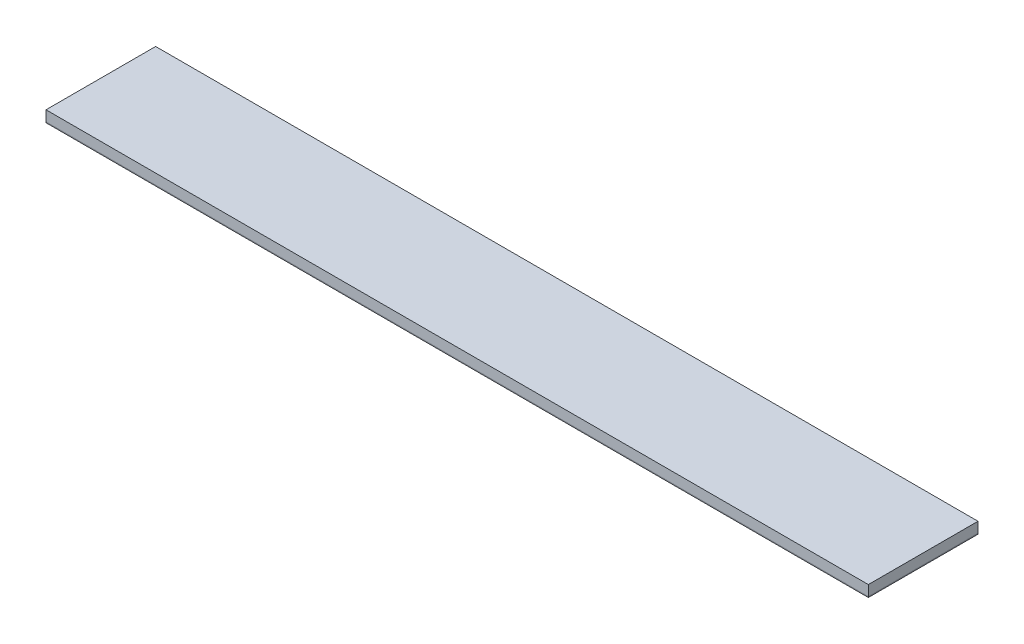
ISO-10303-21;
HEADER;
FILE_DESCRIPTION(('STEP AP214'),'2;1');
FILE_NAME('part.step','',(''),(''),'','','');
FILE_SCHEMA(('AUTOMOTIVE_DESIGN { 1 0 10303 214 1 1 1 1 }'));
ENDSEC;
DATA;
#1=APPLICATION_CONTEXT('core data for automotive mechanical design processes');
#2=APPLICATION_PROTOCOL_DEFINITION('international standard','automotive_design',2000,#1);
#3=PRODUCT_CONTEXT('',#1,'mechanical');
#4=PRODUCT('Part','Part','',(#3));
#5=PRODUCT_RELATED_PRODUCT_CATEGORY('part','',(#4));
#6=PRODUCT_DEFINITION_FORMATION('','',#4);
#7=PRODUCT_DEFINITION_CONTEXT('part definition',#1,'design');
#8=PRODUCT_DEFINITION('design','',#6,#7);
#9=PRODUCT_DEFINITION_SHAPE('','',#8);
#10=(LENGTH_UNIT() NAMED_UNIT(*) SI_UNIT(.MILLI.,.METRE.));
#11=(NAMED_UNIT(*) PLANE_ANGLE_UNIT() SI_UNIT($,.RADIAN.));
#12=(NAMED_UNIT(*) SI_UNIT($,.STERADIAN.) SOLID_ANGLE_UNIT());
#13=UNCERTAINTY_MEASURE_WITH_UNIT(LENGTH_MEASURE(1.E-05),#10,'distance_accuracy_value','');
#14=(GEOMETRIC_REPRESENTATION_CONTEXT(3) GLOBAL_UNCERTAINTY_ASSIGNED_CONTEXT((#13)) GLOBAL_UNIT_ASSIGNED_CONTEXT((#10,
#11,#12)) REPRESENTATION_CONTEXT('',''));
#15=CARTESIAN_POINT('',(0.,0.,0.));
#16=DIRECTION('',(0.,0.,1.));
#17=DIRECTION('',(1.,0.,0.));
#18=AXIS2_PLACEMENT_3D('',#15,#16,#17);
#19=CARTESIAN_POINT('',(-750.,0.,100.));
#20=DIRECTION('',(0.,1.,0.));
#21=DIRECTION('',(1.,0.,0.));
#22=AXIS2_PLACEMENT_3D('',#19,#20,#21);
#23=PLANE('',#22);
#24=DIRECTION('',(-1.,0.,0.));
#25=VECTOR('',#24,1.);
#26=CARTESIAN_POINT('',(0.,0.,0.));
#27=LINE('',#26,#25);
#28=CARTESIAN_POINT('',(0.,0.,0.));
#29=VERTEX_POINT('',#28);
#30=CARTESIAN_POINT('',(-1500.,0.,0.));
#31=VERTEX_POINT('',#30);
#32=EDGE_CURVE('P0_E28',#29,#31,#27,.T.);
#33=ORIENTED_EDGE('',*,*,#32,.F.);
#34=DIRECTION('',(0.,0.,-1.));
#35=VECTOR('',#34,1.);
#36=CARTESIAN_POINT('',(0.,0.,200.));
#37=LINE('',#36,#35);
#38=CARTESIAN_POINT('',(0.,0.,200.));
#39=VERTEX_POINT('',#38);
#40=EDGE_CURVE('P0_E89',#39,#29,#37,.T.);
#41=ORIENTED_EDGE('',*,*,#40,.F.);
#42=DIRECTION('',(1.,0.,0.));
#43=VECTOR('',#42,1.);
#44=CARTESIAN_POINT('',(-1500.,0.,200.));
#45=LINE('',#44,#43);
#46=CARTESIAN_POINT('',(-1500.,0.,200.));
#47=VERTEX_POINT('',#46);
#48=EDGE_CURVE('P0_E100',#47,#39,#45,.T.);
#49=ORIENTED_EDGE('',*,*,#48,.F.);
#50=DIRECTION('',(0.,0.,1.));
#51=VECTOR('',#50,1.);
#52=CARTESIAN_POINT('',(-1500.,0.,0.));
#53=LINE('',#52,#51);
#54=EDGE_CURVE('P0_E103',#31,#47,#53,.T.);
#55=ORIENTED_EDGE('',*,*,#54,.F.);
#56=EDGE_LOOP('',(#33,#41,#49,#55));
#57=FACE_BOUND('',#56,.T.);
#58=ADVANCED_FACE('P0_F17',(#57),#23,.F.);
#59=CARTESIAN_POINT('',(-750.,19.,100.));
#60=DIRECTION('',(0.,1.,0.));
#61=DIRECTION('',(1.,0.,0.));
#62=AXIS2_PLACEMENT_3D('',#59,#60,#61);
#63=PLANE('',#62);
#64=DIRECTION('',(-1.,0.,0.));
#65=VECTOR('',#64,1.);
#66=CARTESIAN_POINT('',(0.,19.,0.));
#67=LINE('',#66,#65);
#68=CARTESIAN_POINT('',(0.,19.,0.));
#69=VERTEX_POINT('',#68);
#70=CARTESIAN_POINT('',(-1500.,19.,0.));
#71=VERTEX_POINT('',#70);
#72=EDGE_CURVE('P0_E11',#69,#71,#67,.T.);
#73=ORIENTED_EDGE('',*,*,#72,.T.);
#74=DIRECTION('',(0.,0.,1.));
#75=VECTOR('',#74,1.);
#76=CARTESIAN_POINT('',(-1500.,19.,0.));
#77=LINE('',#76,#75);
#78=CARTESIAN_POINT('',(-1500.,19.,200.));
#79=VERTEX_POINT('',#78);
#80=EDGE_CURVE('P0_E106',#71,#79,#77,.T.);
#81=ORIENTED_EDGE('',*,*,#80,.T.);
#82=DIRECTION('',(1.,0.,0.));
#83=VECTOR('',#82,1.);
#84=CARTESIAN_POINT('',(-1500.,19.,200.));
#85=LINE('',#84,#83);
#86=CARTESIAN_POINT('',(0.,19.,200.));
#87=VERTEX_POINT('',#86);
#88=EDGE_CURVE('P0_E82',#79,#87,#85,.T.);
#89=ORIENTED_EDGE('',*,*,#88,.T.);
#90=DIRECTION('',(0.,0.,-1.));
#91=VECTOR('',#90,1.);
#92=CARTESIAN_POINT('',(0.,19.,200.));
#93=LINE('',#92,#91);
#94=EDGE_CURVE('P0_E79',#87,#69,#93,.T.);
#95=ORIENTED_EDGE('',*,*,#94,.T.);
#96=EDGE_LOOP('',(#73,#81,#89,#95));
#97=FACE_BOUND('',#96,.T.);
#98=ADVANCED_FACE('P0_F80',(#97),#63,.T.);
#99=CARTESIAN_POINT('',(0.,0.,0.));
#100=DIRECTION('',(0.,0.,-1.));
#101=DIRECTION('',(0.,-1.,0.));
#102=AXIS2_PLACEMENT_3D('',#99,#100,#101);
#103=PLANE('',#102);
#104=ORIENTED_EDGE('',*,*,#32,.T.);
#105=DIRECTION('',(0.,1.,0.));
#106=VECTOR('',#105,1.);
#107=CARTESIAN_POINT('',(-1500.,0.,0.));
#108=LINE('',#107,#106);
#109=EDGE_CURVE('P0_E76',#31,#71,#108,.T.);
#110=ORIENTED_EDGE('',*,*,#109,.T.);
#111=ORIENTED_EDGE('',*,*,#72,.F.);
#112=DIRECTION('',(0.,1.,0.));
#113=VECTOR('',#112,1.);
#114=CARTESIAN_POINT('',(0.,0.,0.));
#115=LINE('',#114,#113);
#116=EDGE_CURVE('P0_E73',#29,#69,#115,.T.);
#117=ORIENTED_EDGE('',*,*,#116,.F.);
#118=EDGE_LOOP('',(#104,#110,#111,#117));
#119=FACE_BOUND('',#118,.T.);
#120=ADVANCED_FACE('P0_F71',(#119),#103,.T.);
#121=CARTESIAN_POINT('',(-1500.,0.,0.));
#122=DIRECTION('',(-1.,0.,0.));
#123=DIRECTION('',(0.,0.,1.));
#124=AXIS2_PLACEMENT_3D('',#121,#122,#123);
#125=PLANE('',#124);
#126=ORIENTED_EDGE('',*,*,#54,.T.);
#127=DIRECTION('',(0.,1.,0.));
#128=VECTOR('',#127,1.);
#129=CARTESIAN_POINT('',(-1500.,0.,200.));
#130=LINE('',#129,#128);
#131=EDGE_CURVE('P0_E21',#47,#79,#130,.T.);
#132=ORIENTED_EDGE('',*,*,#131,.T.);
#133=ORIENTED_EDGE('',*,*,#80,.F.);
#134=ORIENTED_EDGE('',*,*,#109,.F.);
#135=EDGE_LOOP('',(#126,#132,#133,#134));
#136=FACE_BOUND('',#135,.T.);
#137=ADVANCED_FACE('P0_F121',(#136),#125,.T.);
#138=CARTESIAN_POINT('',(-1500.,0.,200.));
#139=DIRECTION('',(0.,0.,1.));
#140=DIRECTION('',(1.,0.,0.));
#141=AXIS2_PLACEMENT_3D('',#138,#139,#140);
#142=PLANE('',#141);
#143=ORIENTED_EDGE('',*,*,#48,.T.);
#144=DIRECTION('',(0.,1.,0.));
#145=VECTOR('',#144,1.);
#146=CARTESIAN_POINT('',(0.,0.,200.));
#147=LINE('',#146,#145);
#148=EDGE_CURVE('P0_E87',#39,#87,#147,.T.);
#149=ORIENTED_EDGE('',*,*,#148,.T.);
#150=ORIENTED_EDGE('',*,*,#88,.F.);
#151=ORIENTED_EDGE('',*,*,#131,.F.);
#152=EDGE_LOOP('',(#143,#149,#150,#151));
#153=FACE_BOUND('',#152,.T.);
#154=ADVANCED_FACE('P0_F124',(#153),#142,.T.);
#155=CARTESIAN_POINT('',(0.,0.,200.));
#156=DIRECTION('',(1.,0.,0.));
#157=DIRECTION('',(0.,1.,0.));
#158=AXIS2_PLACEMENT_3D('',#155,#156,#157);
#159=PLANE('',#158);
#160=ORIENTED_EDGE('',*,*,#40,.T.);
#161=ORIENTED_EDGE('',*,*,#116,.T.);
#162=ORIENTED_EDGE('',*,*,#94,.F.);
#163=ORIENTED_EDGE('',*,*,#148,.F.);
#164=EDGE_LOOP('',(#160,#161,#162,#163));
#165=FACE_BOUND('',#164,.T.);
#166=ADVANCED_FACE('P0_F19',(#165),#159,.T.);
#167=CLOSED_SHELL('',(#58,#98,#120,#137,#154,#166));
#168=MANIFOLD_SOLID_BREP('P0_B1',#167);
#169=CARTESIAN_POINT('',(-750.,0.,100.));
#170=DIRECTION('',(0.,1.,0.));
#171=DIRECTION('',(0.,0.,-1.));
#172=AXIS2_PLACEMENT_3D('',#169,#170,#171);
#173=PLANE('',#172);
#174=DIRECTION('',(1.,0.,0.));
#175=VECTOR('',#174,1.);
#176=CARTESIAN_POINT('',(-1500.,0.,0.));
#177=LINE('',#176,#175);
#178=CARTESIAN_POINT('',(-1500.,0.,0.));
#179=VERTEX_POINT('',#178);
#180=CARTESIAN_POINT('',(0.,0.,0.));
#181=VERTEX_POINT('',#180);
#182=EDGE_CURVE('P1_E27',#179,#181,#177,.T.);
#183=ORIENTED_EDGE('',*,*,#182,.F.);
#184=DIRECTION('',(0.,0.,-1.));
#185=VECTOR('',#184,1.);
#186=CARTESIAN_POINT('',(-1500.,0.,200.));
#187=LINE('',#186,#185);
#188=CARTESIAN_POINT('',(-1500.,0.,200.));
#189=VERTEX_POINT('',#188);
#190=EDGE_CURVE('P1_E73',#189,#179,#187,.T.);
#191=ORIENTED_EDGE('',*,*,#190,.F.);
#192=DIRECTION('',(-1.,0.,0.));
#193=VECTOR('',#192,1.);
#194=CARTESIAN_POINT('',(0.,0.,200.));
#195=LINE('',#194,#193);
#196=CARTESIAN_POINT('',(0.,0.,200.));
#197=VERTEX_POINT('',#196);
#198=EDGE_CURVE('P1_E20',#197,#189,#195,.T.);
#199=ORIENTED_EDGE('',*,*,#198,.F.);
#200=DIRECTION('',(0.,0.,1.));
#201=VECTOR('',#200,1.);
#202=CARTESIAN_POINT('',(0.,0.,0.));
#203=LINE('',#202,#201);
#204=EDGE_CURVE('P1_E74',#181,#197,#203,.T.);
#205=ORIENTED_EDGE('',*,*,#204,.F.);
#206=EDGE_LOOP('',(#183,#191,#199,#205));
#207=FACE_BOUND('',#206,.T.);
#208=ADVANCED_FACE('P1_F17',(#207),#173,.T.);
#209=CARTESIAN_POINT('',(-750.,-1.49999999999996,100.));
#210=DIRECTION('',(0.,-1.,0.));
#211=DIRECTION('',(-1.,0.,0.));
#212=AXIS2_PLACEMENT_3D('',#209,#210,#211);
#213=PLANE('',#212);
#214=DIRECTION('',(1.,0.,0.));
#215=VECTOR('',#214,1.);
#216=CARTESIAN_POINT('',(-1500.,-1.49999999999996,0.));
#217=LINE('',#216,#215);
#218=CARTESIAN_POINT('',(-1500.,-1.49999999999996,0.));
#219=VERTEX_POINT('',#218);
#220=CARTESIAN_POINT('',(0.,-1.50000000000004,0.));
#221=VERTEX_POINT('',#220);
#222=EDGE_CURVE('P1_E11',#219,#221,#217,.T.);
#223=ORIENTED_EDGE('',*,*,#222,.T.);
#224=DIRECTION('',(0.,0.,1.));
#225=VECTOR('',#224,1.);
#226=CARTESIAN_POINT('',(0.,-1.50000000000004,0.));
#227=LINE('',#226,#225);
#228=CARTESIAN_POINT('',(0.,-1.50000000000004,200.));
#229=VERTEX_POINT('',#228);
#230=EDGE_CURVE('P1_E96',#221,#229,#227,.T.);
#231=ORIENTED_EDGE('',*,*,#230,.T.);
#232=DIRECTION('',(-1.,0.,0.));
#233=VECTOR('',#232,1.);
#234=CARTESIAN_POINT('',(0.,-1.50000000000004,200.));
#235=LINE('',#234,#233);
#236=CARTESIAN_POINT('',(-1500.,-1.49999999999996,200.));
#237=VERTEX_POINT('',#236);
#238=EDGE_CURVE('P1_E103',#229,#237,#235,.T.);
#239=ORIENTED_EDGE('',*,*,#238,.T.);
#240=DIRECTION('',(0.,0.,-1.));
#241=VECTOR('',#240,1.);
#242=CARTESIAN_POINT('',(-1500.,-1.49999999999996,200.));
#243=LINE('',#242,#241);
#244=EDGE_CURVE('P1_E86',#237,#219,#243,.T.);
#245=ORIENTED_EDGE('',*,*,#244,.T.);
#246=EDGE_LOOP('',(#223,#231,#239,#245));
#247=FACE_BOUND('',#246,.T.);
#248=ADVANCED_FACE('P1_F120',(#247),#213,.T.);
#249=CARTESIAN_POINT('',(-1500.,0.,0.));
#250=DIRECTION('',(0.,0.,-1.));
#251=DIRECTION('',(0.,-1.,0.));
#252=AXIS2_PLACEMENT_3D('',#249,#250,#251);
#253=PLANE('',#252);
#254=ORIENTED_EDGE('',*,*,#182,.T.);
#255=DIRECTION('',(0.,-1.,0.));
#256=VECTOR('',#255,1.);
#257=CARTESIAN_POINT('',(0.,0.,0.));
#258=LINE('',#257,#256);
#259=EDGE_CURVE('P1_E78',#181,#221,#258,.T.);
#260=ORIENTED_EDGE('',*,*,#259,.T.);
#261=ORIENTED_EDGE('',*,*,#222,.F.);
#262=DIRECTION('',(0.,-1.,0.));
#263=VECTOR('',#262,1.);
#264=CARTESIAN_POINT('',(-1500.,0.,0.));
#265=LINE('',#264,#263);
#266=EDGE_CURVE('P1_E81',#179,#219,#265,.T.);
#267=ORIENTED_EDGE('',*,*,#266,.F.);
#268=EDGE_LOOP('',(#254,#260,#261,#267));
#269=FACE_BOUND('',#268,.T.);
#270=ADVANCED_FACE('P1_F82',(#269),#253,.T.);
#271=CARTESIAN_POINT('',(0.,0.,0.));
#272=DIRECTION('',(1.,0.,0.));
#273=DIRECTION('',(0.,0.,-1.));
#274=AXIS2_PLACEMENT_3D('',#271,#272,#273);
#275=PLANE('',#274);
#276=ORIENTED_EDGE('',*,*,#204,.T.);
#277=DIRECTION('',(0.,-1.,0.));
#278=VECTOR('',#277,1.);
#279=CARTESIAN_POINT('',(0.,0.,200.));
#280=LINE('',#279,#278);
#281=EDGE_CURVE('P1_E106',#197,#229,#280,.T.);
#282=ORIENTED_EDGE('',*,*,#281,.T.);
#283=ORIENTED_EDGE('',*,*,#230,.F.);
#284=ORIENTED_EDGE('',*,*,#259,.F.);
#285=EDGE_LOOP('',(#276,#282,#283,#284));
#286=FACE_BOUND('',#285,.T.);
#287=ADVANCED_FACE('P1_F117',(#286),#275,.T.);
#288=CARTESIAN_POINT('',(0.,0.,200.));
#289=DIRECTION('',(0.,0.,1.));
#290=DIRECTION('',(0.,-1.,0.));
#291=AXIS2_PLACEMENT_3D('',#288,#289,#290);
#292=PLANE('',#291);
#293=ORIENTED_EDGE('',*,*,#198,.T.);
#294=DIRECTION('',(0.,-1.,0.));
#295=VECTOR('',#294,1.);
#296=CARTESIAN_POINT('',(-1500.,0.,200.));
#297=LINE('',#296,#295);
#298=EDGE_CURVE('P1_E89',#189,#237,#297,.T.);
#299=ORIENTED_EDGE('',*,*,#298,.T.);
#300=ORIENTED_EDGE('',*,*,#238,.F.);
#301=ORIENTED_EDGE('',*,*,#281,.F.);
#302=EDGE_LOOP('',(#293,#299,#300,#301));
#303=FACE_BOUND('',#302,.T.);
#304=ADVANCED_FACE('P1_F119',(#303),#292,.T.);
#305=CARTESIAN_POINT('',(-1500.,0.,200.));
#306=DIRECTION('',(-1.,0.,0.));
#307=DIRECTION('',(0.,0.,1.));
#308=AXIS2_PLACEMENT_3D('',#305,#306,#307);
#309=PLANE('',#308);
#310=ORIENTED_EDGE('',*,*,#190,.T.);
#311=ORIENTED_EDGE('',*,*,#266,.T.);
#312=ORIENTED_EDGE('',*,*,#244,.F.);
#313=ORIENTED_EDGE('',*,*,#298,.F.);
#314=EDGE_LOOP('',(#310,#311,#312,#313));
#315=FACE_BOUND('',#314,.T.);
#316=ADVANCED_FACE('P1_F88',(#315),#309,.T.);
#317=CLOSED_SHELL('',(#208,#248,#270,#287,#304,#316));
#318=MANIFOLD_SOLID_BREP('P1_B1',#317);
#319=ADVANCED_BREP_SHAPE_REPRESENTATION('',(#18,#168,#318),#14);
#320=SHAPE_DEFINITION_REPRESENTATION(#9,#319);
ENDSEC;
END-ISO-10303-21;
